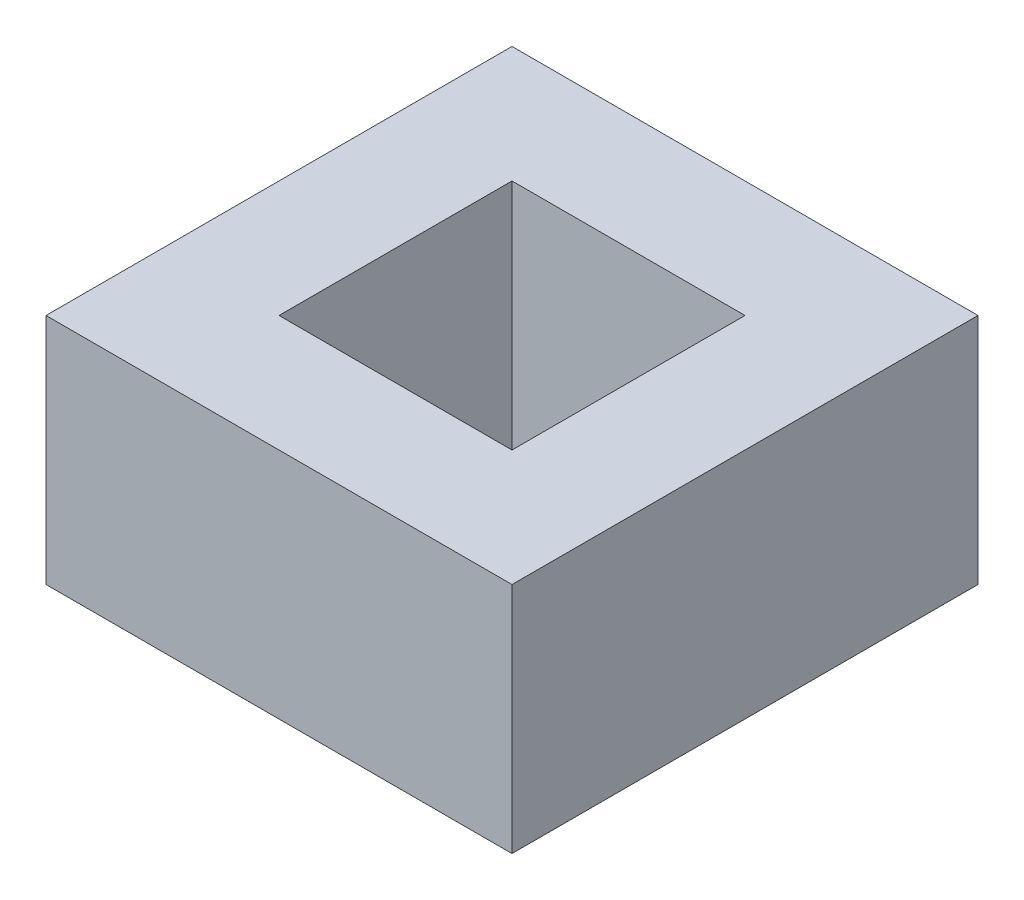
ISO-10303-21;
HEADER;
FILE_DESCRIPTION(('STEP AP214'),'2;1');
FILE_NAME('part.step','',(''),(''),'','','');
FILE_SCHEMA(('AUTOMOTIVE_DESIGN { 1 0 10303 214 1 1 1 1 }'));
ENDSEC;
DATA;
#1=APPLICATION_CONTEXT('core data for automotive mechanical design processes');
#2=APPLICATION_PROTOCOL_DEFINITION('international standard','automotive_design',2000,#1);
#3=PRODUCT_CONTEXT('',#1,'mechanical');
#4=PRODUCT('Part','Part','',(#3));
#5=PRODUCT_RELATED_PRODUCT_CATEGORY('part','',(#4));
#6=PRODUCT_DEFINITION_FORMATION('','',#4);
#7=PRODUCT_DEFINITION_CONTEXT('part definition',#1,'design');
#8=PRODUCT_DEFINITION('design','',#6,#7);
#9=PRODUCT_DEFINITION_SHAPE('','',#8);
#10=(LENGTH_UNIT() NAMED_UNIT(*) SI_UNIT(.MILLI.,.METRE.));
#11=(NAMED_UNIT(*) PLANE_ANGLE_UNIT() SI_UNIT($,.RADIAN.));
#12=(NAMED_UNIT(*) SI_UNIT($,.STERADIAN.) SOLID_ANGLE_UNIT());
#13=UNCERTAINTY_MEASURE_WITH_UNIT(LENGTH_MEASURE(1.E-05),#10,'distance_accuracy_value','');
#14=(GEOMETRIC_REPRESENTATION_CONTEXT(3) GLOBAL_UNCERTAINTY_ASSIGNED_CONTEXT((#13)) GLOBAL_UNIT_ASSIGNED_CONTEXT((#10,
#11,#12)) REPRESENTATION_CONTEXT('',''));
#15=CARTESIAN_POINT('',(0.,0.,0.));
#16=DIRECTION('',(0.,0.,1.));
#17=DIRECTION('',(1.,0.,0.));
#18=AXIS2_PLACEMENT_3D('',#15,#16,#17);
#19=CARTESIAN_POINT('',(0.,20.,0.));
#20=DIRECTION('',(0.,-1.,0.));
#21=DIRECTION('',(0.,0.,-1.));
#22=AXIS2_PLACEMENT_3D('',#19,#20,#21);
#23=PLANE('',#22);
#24=DIRECTION('',(0.,0.,-1.));
#25=VECTOR('',#24,1.);
#26=CARTESIAN_POINT('',(0.,20.,0.));
#27=LINE('',#26,#25);
#28=CARTESIAN_POINT('',(0.,20.,40.));
#29=VERTEX_POINT('',#28);
#30=CARTESIAN_POINT('',(0.,20.,0.));
#31=VERTEX_POINT('',#30);
#32=EDGE_CURVE('E153',#29,#31,#27,.T.);
#33=ORIENTED_EDGE('',*,*,#32,.T.);
#34=DIRECTION('',(-1.,0.,0.));
#35=VECTOR('',#34,1.);
#36=CARTESIAN_POINT('',(0.,20.,0.));
#37=LINE('',#36,#35);
#38=CARTESIAN_POINT('',(-40.,20.,0.));
#39=VERTEX_POINT('',#38);
#40=EDGE_CURVE('E157',#31,#39,#37,.T.);
#41=ORIENTED_EDGE('',*,*,#40,.T.);
#42=DIRECTION('',(0.,0.,1.));
#43=VECTOR('',#42,1.);
#44=CARTESIAN_POINT('',(-40.,20.,0.));
#45=LINE('',#44,#43);
#46=CARTESIAN_POINT('',(-40.,20.,40.));
#47=VERTEX_POINT('',#46);
#48=EDGE_CURVE('E161',#39,#47,#45,.T.);
#49=ORIENTED_EDGE('',*,*,#48,.T.);
#50=DIRECTION('',(1.,0.,0.));
#51=VECTOR('',#50,1.);
#52=CARTESIAN_POINT('',(0.,20.,40.));
#53=LINE('',#52,#51);
#54=EDGE_CURVE('E164',#47,#29,#53,.T.);
#55=ORIENTED_EDGE('',*,*,#54,.T.);
#56=EDGE_LOOP('',(#33,#41,#49,#55));
#57=FACE_BOUND('',#56,.T.);
#58=DIRECTION('',(0.,0.,-1.));
#59=VECTOR('',#58,1.);
#60=CARTESIAN_POINT('',(-10.,20.,10.));
#61=LINE('',#60,#59);
#62=CARTESIAN_POINT('',(-10.,20.,30.));
#63=VERTEX_POINT('',#62);
#64=CARTESIAN_POINT('',(-10.,20.,10.));
#65=VERTEX_POINT('',#64);
#66=EDGE_CURVE('E105',#63,#65,#61,.T.);
#67=ORIENTED_EDGE('',*,*,#66,.F.);
#68=DIRECTION('',(1.,0.,0.));
#69=VECTOR('',#68,1.);
#70=CARTESIAN_POINT('',(-10.,20.,30.));
#71=LINE('',#70,#69);
#72=CARTESIAN_POINT('',(-30.,20.,30.));
#73=VERTEX_POINT('',#72);
#74=EDGE_CURVE('E131',#73,#63,#71,.T.);
#75=ORIENTED_EDGE('',*,*,#74,.F.);
#76=DIRECTION('',(0.,0.,1.));
#77=VECTOR('',#76,1.);
#78=CARTESIAN_POINT('',(-30.,20.,10.));
#79=LINE('',#78,#77);
#80=CARTESIAN_POINT('',(-30.,20.,10.));
#81=VERTEX_POINT('',#80);
#82=EDGE_CURVE('E127',#81,#73,#79,.T.);
#83=ORIENTED_EDGE('',*,*,#82,.F.);
#84=DIRECTION('',(-1.,0.,0.));
#85=VECTOR('',#84,1.);
#86=CARTESIAN_POINT('',(-10.,20.,10.));
#87=LINE('',#86,#85);
#88=EDGE_CURVE('E114',#65,#81,#87,.T.);
#89=ORIENTED_EDGE('',*,*,#88,.F.);
#90=EDGE_LOOP('',(#67,#75,#83,#89));
#91=FACE_BOUND('',#90,.T.);
#92=ADVANCED_FACE('F39',(#57,#91),#23,.F.);
#93=CARTESIAN_POINT('',(0.,0.,0.));
#94=DIRECTION('',(0.,-1.,0.));
#95=DIRECTION('',(0.,0.,-1.));
#96=AXIS2_PLACEMENT_3D('',#93,#94,#95);
#97=PLANE('',#96);
#98=DIRECTION('',(0.,0.,-1.));
#99=VECTOR('',#98,1.);
#100=CARTESIAN_POINT('',(0.,0.,0.));
#101=LINE('',#100,#99);
#102=CARTESIAN_POINT('',(0.,0.,40.));
#103=VERTEX_POINT('',#102);
#104=CARTESIAN_POINT('',(0.,0.,0.));
#105=VERTEX_POINT('',#104);
#106=EDGE_CURVE('E123',#103,#105,#101,.T.);
#107=ORIENTED_EDGE('',*,*,#106,.F.);
#108=DIRECTION('',(1.,0.,0.));
#109=VECTOR('',#108,1.);
#110=CARTESIAN_POINT('',(0.,0.,40.));
#111=LINE('',#110,#109);
#112=CARTESIAN_POINT('',(-40.,0.,40.));
#113=VERTEX_POINT('',#112);
#114=EDGE_CURVE('E158',#113,#103,#111,.T.);
#115=ORIENTED_EDGE('',*,*,#114,.F.);
#116=DIRECTION('',(0.,0.,1.));
#117=VECTOR('',#116,1.);
#118=CARTESIAN_POINT('',(-40.,0.,0.));
#119=LINE('',#118,#117);
#120=CARTESIAN_POINT('',(-40.,0.,0.));
#121=VERTEX_POINT('',#120);
#122=EDGE_CURVE('E174',#121,#113,#119,.T.);
#123=ORIENTED_EDGE('',*,*,#122,.F.);
#124=DIRECTION('',(-1.,0.,0.));
#125=VECTOR('',#124,1.);
#126=CARTESIAN_POINT('',(0.,0.,0.));
#127=LINE('',#126,#125);
#128=EDGE_CURVE('E171',#105,#121,#127,.T.);
#129=ORIENTED_EDGE('',*,*,#128,.F.);
#130=EDGE_LOOP('',(#107,#115,#123,#129));
#131=FACE_BOUND('',#130,.T.);
#132=DIRECTION('',(1.,0.,0.));
#133=VECTOR('',#132,1.);
#134=CARTESIAN_POINT('',(-10.,0.,30.));
#135=LINE('',#134,#133);
#136=CARTESIAN_POINT('',(-30.,0.,30.));
#137=VERTEX_POINT('',#136);
#138=CARTESIAN_POINT('',(-10.,0.,30.));
#139=VERTEX_POINT('',#138);
#140=EDGE_CURVE('E115',#137,#139,#135,.T.);
#141=ORIENTED_EDGE('',*,*,#140,.T.);
#142=DIRECTION('',(0.,0.,-1.));
#143=VECTOR('',#142,1.);
#144=CARTESIAN_POINT('',(-10.,0.,10.));
#145=LINE('',#144,#143);
#146=CARTESIAN_POINT('',(-10.,0.,10.));
#147=VERTEX_POINT('',#146);
#148=EDGE_CURVE('E63',#139,#147,#145,.T.);
#149=ORIENTED_EDGE('',*,*,#148,.T.);
#150=DIRECTION('',(-1.,0.,0.));
#151=VECTOR('',#150,1.);
#152=CARTESIAN_POINT('',(-10.,0.,10.));
#153=LINE('',#152,#151);
#154=CARTESIAN_POINT('',(-30.,0.,10.));
#155=VERTEX_POINT('',#154);
#156=EDGE_CURVE('E121',#147,#155,#153,.T.);
#157=ORIENTED_EDGE('',*,*,#156,.T.);
#158=DIRECTION('',(0.,0.,1.));
#159=VECTOR('',#158,1.);
#160=CARTESIAN_POINT('',(-30.,0.,10.));
#161=LINE('',#160,#159);
#162=EDGE_CURVE('E140',#155,#137,#161,.T.);
#163=ORIENTED_EDGE('',*,*,#162,.T.);
#164=EDGE_LOOP('',(#141,#149,#157,#163));
#165=FACE_BOUND('',#164,.T.);
#166=ADVANCED_FACE('F197',(#131,#165),#97,.T.);
#167=CARTESIAN_POINT('',(0.,20.,0.));
#168=DIRECTION('',(-1.,0.,0.));
#169=DIRECTION('',(0.,0.,1.));
#170=AXIS2_PLACEMENT_3D('',#167,#168,#169);
#171=PLANE('',#170);
#172=ORIENTED_EDGE('',*,*,#106,.T.);
#173=DIRECTION('',(0.,-1.,0.));
#174=VECTOR('',#173,1.);
#175=CARTESIAN_POINT('',(0.,20.,0.));
#176=LINE('',#175,#174);
#177=EDGE_CURVE('E11',#31,#105,#176,.T.);
#178=ORIENTED_EDGE('',*,*,#177,.F.);
#179=ORIENTED_EDGE('',*,*,#32,.F.);
#180=DIRECTION('',(0.,-1.,0.));
#181=VECTOR('',#180,1.);
#182=CARTESIAN_POINT('',(0.,20.,40.));
#183=LINE('',#182,#181);
#184=EDGE_CURVE('E167',#29,#103,#183,.T.);
#185=ORIENTED_EDGE('',*,*,#184,.T.);
#186=EDGE_LOOP('',(#172,#178,#179,#185));
#187=FACE_BOUND('',#186,.T.);
#188=ADVANCED_FACE('F41',(#187),#171,.F.);
#189=CARTESIAN_POINT('',(0.,20.,0.));
#190=DIRECTION('',(0.,0.,1.));
#191=DIRECTION('',(1.,0.,0.));
#192=AXIS2_PLACEMENT_3D('',#189,#190,#191);
#193=PLANE('',#192);
#194=ORIENTED_EDGE('',*,*,#128,.T.);
#195=DIRECTION('',(0.,-1.,0.));
#196=VECTOR('',#195,1.);
#197=CARTESIAN_POINT('',(-40.,20.,0.));
#198=LINE('',#197,#196);
#199=EDGE_CURVE('E48',#39,#121,#198,.T.);
#200=ORIENTED_EDGE('',*,*,#199,.F.);
#201=ORIENTED_EDGE('',*,*,#40,.F.);
#202=ORIENTED_EDGE('',*,*,#177,.T.);
#203=EDGE_LOOP('',(#194,#200,#201,#202));
#204=FACE_BOUND('',#203,.T.);
#205=ADVANCED_FACE('F207',(#204),#193,.F.);
#206=CARTESIAN_POINT('',(-40.,20.,0.));
#207=DIRECTION('',(1.,0.,0.));
#208=DIRECTION('',(0.,0.,-1.));
#209=AXIS2_PLACEMENT_3D('',#206,#207,#208);
#210=PLANE('',#209);
#211=ORIENTED_EDGE('',*,*,#122,.T.);
#212=DIRECTION('',(0.,-1.,0.));
#213=VECTOR('',#212,1.);
#214=CARTESIAN_POINT('',(-40.,20.,40.));
#215=LINE('',#214,#213);
#216=EDGE_CURVE('E182',#47,#113,#215,.T.);
#217=ORIENTED_EDGE('',*,*,#216,.F.);
#218=ORIENTED_EDGE('',*,*,#48,.F.);
#219=ORIENTED_EDGE('',*,*,#199,.T.);
#220=EDGE_LOOP('',(#211,#217,#218,#219));
#221=FACE_BOUND('',#220,.T.);
#222=ADVANCED_FACE('F191',(#221),#210,.F.);
#223=CARTESIAN_POINT('',(0.,20.,40.));
#224=DIRECTION('',(0.,0.,-1.));
#225=DIRECTION('',(-1.,0.,0.));
#226=AXIS2_PLACEMENT_3D('',#223,#224,#225);
#227=PLANE('',#226);
#228=ORIENTED_EDGE('',*,*,#114,.T.);
#229=ORIENTED_EDGE('',*,*,#184,.F.);
#230=ORIENTED_EDGE('',*,*,#54,.F.);
#231=ORIENTED_EDGE('',*,*,#216,.T.);
#232=EDGE_LOOP('',(#228,#229,#230,#231));
#233=FACE_BOUND('',#232,.T.);
#234=ADVANCED_FACE('F201',(#233),#227,.F.);
#235=CARTESIAN_POINT('',(-10.,20.,10.));
#236=DIRECTION('',(-1.,0.,0.));
#237=DIRECTION('',(0.,0.,1.));
#238=AXIS2_PLACEMENT_3D('',#235,#236,#237);
#239=PLANE('',#238);
#240=ORIENTED_EDGE('',*,*,#148,.F.);
#241=DIRECTION('',(0.,-1.,0.));
#242=VECTOR('',#241,1.);
#243=CARTESIAN_POINT('',(-10.,20.,30.));
#244=LINE('',#243,#242);
#245=EDGE_CURVE('E109',#63,#139,#244,.T.);
#246=ORIENTED_EDGE('',*,*,#245,.F.);
#247=ORIENTED_EDGE('',*,*,#66,.T.);
#248=DIRECTION('',(0.,-1.,0.));
#249=VECTOR('',#248,1.);
#250=CARTESIAN_POINT('',(-10.,20.,10.));
#251=LINE('',#250,#249);
#252=EDGE_CURVE('E108',#65,#147,#251,.T.);
#253=ORIENTED_EDGE('',*,*,#252,.T.);
#254=EDGE_LOOP('',(#240,#246,#247,#253));
#255=FACE_BOUND('',#254,.T.);
#256=ADVANCED_FACE('F107',(#255),#239,.T.);
#257=CARTESIAN_POINT('',(-10.,20.,10.));
#258=DIRECTION('',(0.,0.,1.));
#259=DIRECTION('',(1.,0.,0.));
#260=AXIS2_PLACEMENT_3D('',#257,#258,#259);
#261=PLANE('',#260);
#262=ORIENTED_EDGE('',*,*,#156,.F.);
#263=ORIENTED_EDGE('',*,*,#252,.F.);
#264=ORIENTED_EDGE('',*,*,#88,.T.);
#265=DIRECTION('',(0.,-1.,0.));
#266=VECTOR('',#265,1.);
#267=CARTESIAN_POINT('',(-30.,20.,10.));
#268=LINE('',#267,#266);
#269=EDGE_CURVE('E124',#81,#155,#268,.T.);
#270=ORIENTED_EDGE('',*,*,#269,.T.);
#271=EDGE_LOOP('',(#262,#263,#264,#270));
#272=FACE_BOUND('',#271,.T.);
#273=ADVANCED_FACE('F118',(#272),#261,.T.);
#274=CARTESIAN_POINT('',(-30.,20.,10.));
#275=DIRECTION('',(1.,0.,0.));
#276=DIRECTION('',(0.,0.,-1.));
#277=AXIS2_PLACEMENT_3D('',#274,#275,#276);
#278=PLANE('',#277);
#279=ORIENTED_EDGE('',*,*,#162,.F.);
#280=ORIENTED_EDGE('',*,*,#269,.F.);
#281=ORIENTED_EDGE('',*,*,#82,.T.);
#282=DIRECTION('',(0.,-1.,0.));
#283=VECTOR('',#282,1.);
#284=CARTESIAN_POINT('',(-30.,20.,30.));
#285=LINE('',#284,#283);
#286=EDGE_CURVE('E55',#73,#137,#285,.T.);
#287=ORIENTED_EDGE('',*,*,#286,.T.);
#288=EDGE_LOOP('',(#279,#280,#281,#287));
#289=FACE_BOUND('',#288,.T.);
#290=ADVANCED_FACE('F230',(#289),#278,.T.);
#291=CARTESIAN_POINT('',(-10.,20.,30.));
#292=DIRECTION('',(0.,0.,-1.));
#293=DIRECTION('',(-1.,0.,0.));
#294=AXIS2_PLACEMENT_3D('',#291,#292,#293);
#295=PLANE('',#294);
#296=ORIENTED_EDGE('',*,*,#140,.F.);
#297=ORIENTED_EDGE('',*,*,#286,.F.);
#298=ORIENTED_EDGE('',*,*,#74,.T.);
#299=ORIENTED_EDGE('',*,*,#245,.T.);
#300=EDGE_LOOP('',(#296,#297,#298,#299));
#301=FACE_BOUND('',#300,.T.);
#302=ADVANCED_FACE('F234',(#301),#295,.T.);
#303=CLOSED_SHELL('',(#92,#166,#188,#205,#222,#234,#256,#273,#290,#302));
#304=MANIFOLD_SOLID_BREP('B2',#303);
#305=ADVANCED_BREP_SHAPE_REPRESENTATION('',(#18,#304),#14);
#306=SHAPE_DEFINITION_REPRESENTATION(#9,#305);
ENDSEC;
END-ISO-10303-21;
